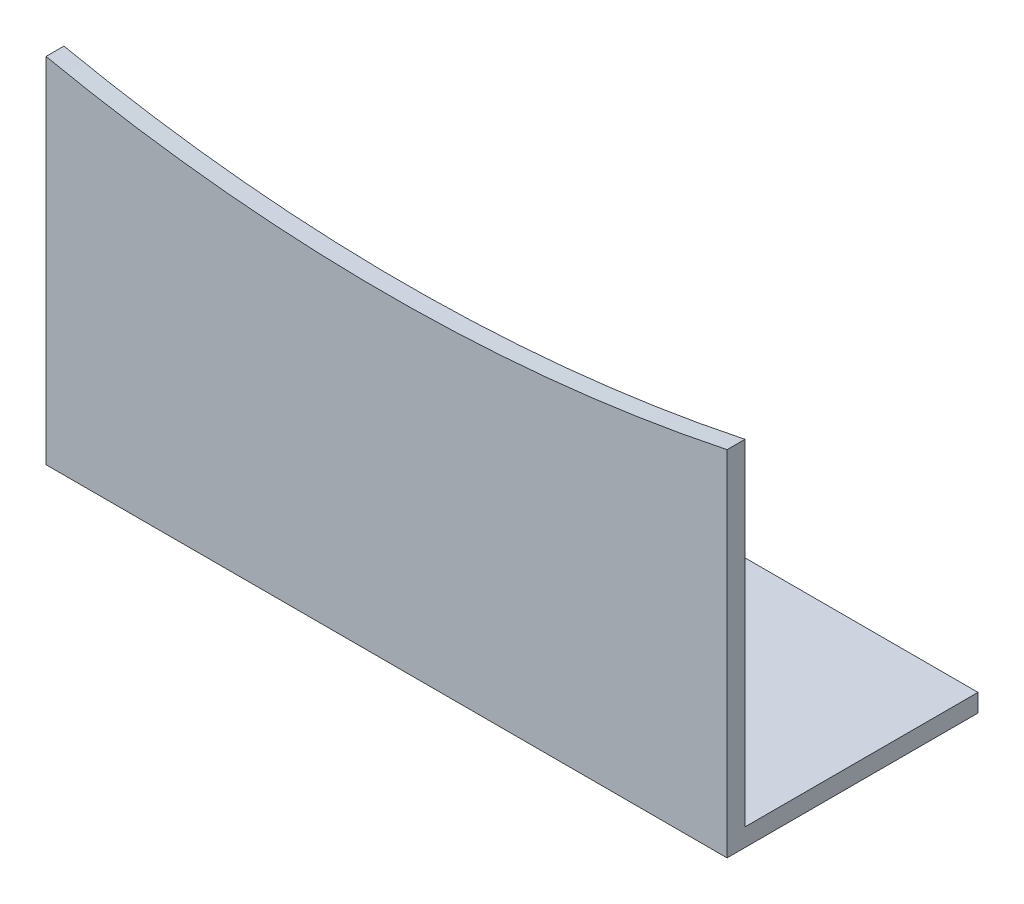
ISO-10303-21;
HEADER;
FILE_DESCRIPTION(('STEP AP214'),'2;1');
FILE_NAME('part.step','',(''),(''),'','','');
FILE_SCHEMA(('AUTOMOTIVE_DESIGN { 1 0 10303 214 1 1 1 1 }'));
ENDSEC;
DATA;
#1=APPLICATION_CONTEXT('core data for automotive mechanical design processes');
#2=APPLICATION_PROTOCOL_DEFINITION('international standard','automotive_design',2000,#1);
#3=PRODUCT_CONTEXT('',#1,'mechanical');
#4=PRODUCT('Part','Part','',(#3));
#5=PRODUCT_RELATED_PRODUCT_CATEGORY('part','',(#4));
#6=PRODUCT_DEFINITION_FORMATION('','',#4);
#7=PRODUCT_DEFINITION_CONTEXT('part definition',#1,'design');
#8=PRODUCT_DEFINITION('design','',#6,#7);
#9=PRODUCT_DEFINITION_SHAPE('','',#8);
#10=(LENGTH_UNIT() NAMED_UNIT(*) SI_UNIT(.MILLI.,.METRE.));
#11=(NAMED_UNIT(*) PLANE_ANGLE_UNIT() SI_UNIT($,.RADIAN.));
#12=(NAMED_UNIT(*) SI_UNIT($,.STERADIAN.) SOLID_ANGLE_UNIT());
#13=UNCERTAINTY_MEASURE_WITH_UNIT(LENGTH_MEASURE(1.E-05),#10,'distance_accuracy_value','');
#14=(GEOMETRIC_REPRESENTATION_CONTEXT(3) GLOBAL_UNCERTAINTY_ASSIGNED_CONTEXT((#13)) GLOBAL_UNIT_ASSIGNED_CONTEXT((#10,
#11,#12)) REPRESENTATION_CONTEXT('',''));
#15=CARTESIAN_POINT('',(0.,0.,0.));
#16=DIRECTION('',(0.,0.,1.));
#17=DIRECTION('',(1.,0.,0.));
#18=AXIS2_PLACEMENT_3D('',#15,#16,#17);
#19=CARTESIAN_POINT('',(38.,-220.,-30.002));
#20=DIRECTION('',(1.,0.,0.));
#21=DIRECTION('',(0.,0.,-1.));
#22=AXIS2_PLACEMENT_3D('',#19,#20,#21);
#23=PLANE('',#22);
#24=DIRECTION('',(0.,1.,0.));
#25=VECTOR('',#24,1.);
#26=CARTESIAN_POINT('',(38.,-220.,-28.));
#27=LINE('',#26,#25);
#28=CARTESIAN_POINT('',(38.,-220.,-28.));
#29=VERTEX_POINT('',#28);
#30=CARTESIAN_POINT('',(38.,-218.,-28.));
#31=VERTEX_POINT('',#30);
#32=EDGE_CURVE('E117',#29,#31,#27,.T.);
#33=ORIENTED_EDGE('',*,*,#32,.T.);
#34=DIRECTION('',(0.,0.,1.));
#35=VECTOR('',#34,1.);
#36=CARTESIAN_POINT('',(38.,-218.,-30.002));
#37=LINE('',#36,#35);
#38=CARTESIAN_POINT('',(38.,-218.,-2.));
#39=VERTEX_POINT('',#38);
#40=EDGE_CURVE('E98',#31,#39,#37,.T.);
#41=ORIENTED_EDGE('',*,*,#40,.T.);
#42=DIRECTION('',(0.,1.,0.));
#43=VECTOR('',#42,1.);
#44=CARTESIAN_POINT('',(38.,0.,-2.));
#45=LINE('',#44,#43);
#46=CARTESIAN_POINT('',(38.,-180.544315889479,-2.));
#47=VERTEX_POINT('',#46);
#48=EDGE_CURVE('E102',#39,#47,#45,.T.);
#49=ORIENTED_EDGE('',*,*,#48,.T.);
#50=DIRECTION('',(0.,0.,1.));
#51=VECTOR('',#50,1.);
#52=CARTESIAN_POINT('',(38.,-180.544315889479,-30.002));
#53=LINE('',#52,#51);
#54=CARTESIAN_POINT('',(38.,-180.544315889479,0.));
#55=VERTEX_POINT('',#54);
#56=EDGE_CURVE('E131',#47,#55,#53,.T.);
#57=ORIENTED_EDGE('',*,*,#56,.T.);
#58=DIRECTION('',(0.,1.,0.));
#59=VECTOR('',#58,1.);
#60=CARTESIAN_POINT('',(38.,-220.,0.));
#61=LINE('',#60,#59);
#62=CARTESIAN_POINT('',(38.,-220.,0.));
#63=VERTEX_POINT('',#62);
#64=EDGE_CURVE('E42',#63,#55,#61,.T.);
#65=ORIENTED_EDGE('',*,*,#64,.F.);
#66=DIRECTION('',(0.,0.,1.));
#67=VECTOR('',#66,1.);
#68=CARTESIAN_POINT('',(38.,-220.,-30.002));
#69=LINE('',#68,#67);
#70=EDGE_CURVE('E58',#29,#63,#69,.T.);
#71=ORIENTED_EDGE('',*,*,#70,.F.);
#72=EDGE_LOOP('',(#33,#41,#49,#57,#65,#71));
#73=FACE_BOUND('',#72,.T.);
#74=ADVANCED_FACE('F33',(#73),#23,.T.);
#75=CARTESIAN_POINT('',(0.,0.,-30.002));
#76=DIRECTION('',(0.,0.,1.));
#77=DIRECTION('',(1.,0.,0.));
#78=AXIS2_PLACEMENT_3D('',#75,#76,#77);
#79=CYLINDRICAL_SURFACE('',#78,184.5);
#80=ORIENTED_EDGE('',*,*,#56,.F.);
#81=CARTESIAN_POINT('',(0.,0.,-2.));
#82=DIRECTION('',(0.,0.,1.));
#83=DIRECTION('',(1.,0.,0.));
#84=AXIS2_PLACEMENT_3D('',#81,#82,#83);
#85=CIRCLE('',#84,184.5);
#86=CARTESIAN_POINT('',(-38.,-180.544315889479,-2.));
#87=VERTEX_POINT('',#86);
#88=EDGE_CURVE('E109',#47,#87,#85,.F.);
#89=ORIENTED_EDGE('',*,*,#88,.T.);
#90=DIRECTION('',(0.,0.,1.));
#91=VECTOR('',#90,1.);
#92=CARTESIAN_POINT('',(-38.,-180.544315889479,-30.002));
#93=LINE('',#92,#91);
#94=CARTESIAN_POINT('',(-38.,-180.544315889479,0.));
#95=VERTEX_POINT('',#94);
#96=EDGE_CURVE('E108',#87,#95,#93,.T.);
#97=ORIENTED_EDGE('',*,*,#96,.T.);
#98=CARTESIAN_POINT('',(0.,0.,0.));
#99=DIRECTION('',(0.,0.,-1.));
#100=DIRECTION('',(1.,0.,0.));
#101=AXIS2_PLACEMENT_3D('',#98,#99,#100);
#102=CIRCLE('',#101,184.5);
#103=EDGE_CURVE('E122',#55,#95,#102,.T.);
#104=ORIENTED_EDGE('',*,*,#103,.F.);
#105=EDGE_LOOP('',(#80,#89,#97,#104));
#106=FACE_BOUND('',#105,.T.);
#107=ADVANCED_FACE('F35',(#106),#79,.F.);
#108=CARTESIAN_POINT('',(0.,0.,-28.));
#109=DIRECTION('',(0.,0.,1.));
#110=DIRECTION('',(1.,0.,0.));
#111=AXIS2_PLACEMENT_3D('',#108,#109,#110);
#112=PLANE('',#111);
#113=DIRECTION('',(0.,-1.,0.));
#114=VECTOR('',#113,1.);
#115=CARTESIAN_POINT('',(-38.,-220.,-28.));
#116=LINE('',#115,#114);
#117=CARTESIAN_POINT('',(-38.,-218.,-28.));
#118=VERTEX_POINT('',#117);
#119=CARTESIAN_POINT('',(-38.,-220.,-28.));
#120=VERTEX_POINT('',#119);
#121=EDGE_CURVE('E120',#118,#120,#116,.T.);
#122=ORIENTED_EDGE('',*,*,#121,.F.);
#123=DIRECTION('',(1.,0.,0.));
#124=VECTOR('',#123,1.);
#125=CARTESIAN_POINT('',(0.,-218.,-28.));
#126=LINE('',#125,#124);
#127=EDGE_CURVE('E95',#118,#31,#126,.T.);
#128=ORIENTED_EDGE('',*,*,#127,.T.);
#129=ORIENTED_EDGE('',*,*,#32,.F.);
#130=DIRECTION('',(1.,0.,0.));
#131=VECTOR('',#130,1.);
#132=CARTESIAN_POINT('',(-40.,-220.,-28.));
#133=LINE('',#132,#131);
#134=EDGE_CURVE('E103',#120,#29,#133,.T.);
#135=ORIENTED_EDGE('',*,*,#134,.F.);
#136=EDGE_LOOP('',(#122,#128,#129,#135));
#137=FACE_BOUND('',#136,.T.);
#138=ADVANCED_FACE('F146',(#137),#112,.F.);
#139=CARTESIAN_POINT('',(-38.,-180.544315889479,-30.002));
#140=DIRECTION('',(-1.,0.,0.));
#141=DIRECTION('',(0.,0.,1.));
#142=AXIS2_PLACEMENT_3D('',#139,#140,#141);
#143=PLANE('',#142);
#144=DIRECTION('',(0.,0.,1.));
#145=VECTOR('',#144,1.);
#146=CARTESIAN_POINT('',(-38.,-218.,-30.002));
#147=LINE('',#146,#145);
#148=CARTESIAN_POINT('',(-38.,-218.,-2.));
#149=VERTEX_POINT('',#148);
#150=EDGE_CURVE('E90',#118,#149,#147,.T.);
#151=ORIENTED_EDGE('',*,*,#150,.F.);
#152=ORIENTED_EDGE('',*,*,#121,.T.);
#153=DIRECTION('',(0.,0.,1.));
#154=VECTOR('',#153,1.);
#155=CARTESIAN_POINT('',(-38.,-220.,-30.002));
#156=LINE('',#155,#154);
#157=CARTESIAN_POINT('',(-38.,-220.,0.));
#158=VERTEX_POINT('',#157);
#159=EDGE_CURVE('E37',#120,#158,#156,.T.);
#160=ORIENTED_EDGE('',*,*,#159,.T.);
#161=DIRECTION('',(0.,-1.,0.));
#162=VECTOR('',#161,1.);
#163=CARTESIAN_POINT('',(-38.,-180.544315889479,0.));
#164=LINE('',#163,#162);
#165=EDGE_CURVE('E124',#95,#158,#164,.T.);
#166=ORIENTED_EDGE('',*,*,#165,.F.);
#167=ORIENTED_EDGE('',*,*,#96,.F.);
#168=DIRECTION('',(0.,-1.,0.));
#169=VECTOR('',#168,1.);
#170=CARTESIAN_POINT('',(-38.,0.,-2.));
#171=LINE('',#170,#169);
#172=EDGE_CURVE('E50',#87,#149,#171,.T.);
#173=ORIENTED_EDGE('',*,*,#172,.T.);
#174=EDGE_LOOP('',(#151,#152,#160,#166,#167,#173));
#175=FACE_BOUND('',#174,.T.);
#176=ADVANCED_FACE('F106',(#175),#143,.T.);
#177=CARTESIAN_POINT('',(-38.,-220.,-30.002));
#178=DIRECTION('',(0.,-1.,0.));
#179=DIRECTION('',(0.,0.,-1.));
#180=AXIS2_PLACEMENT_3D('',#177,#178,#179);
#181=PLANE('',#180);
#182=ORIENTED_EDGE('',*,*,#159,.F.);
#183=ORIENTED_EDGE('',*,*,#134,.T.);
#184=ORIENTED_EDGE('',*,*,#70,.T.);
#185=DIRECTION('',(1.,0.,0.));
#186=VECTOR('',#185,1.);
#187=CARTESIAN_POINT('',(-38.,-220.,0.));
#188=LINE('',#187,#186);
#189=EDGE_CURVE('E11',#158,#63,#188,.T.);
#190=ORIENTED_EDGE('',*,*,#189,.F.);
#191=EDGE_LOOP('',(#182,#183,#184,#190));
#192=FACE_BOUND('',#191,.T.);
#193=ADVANCED_FACE('F138',(#192),#181,.T.);
#194=CARTESIAN_POINT('',(0.,0.,0.));
#195=DIRECTION('',(0.,0.,1.));
#196=DIRECTION('',(1.,0.,0.));
#197=AXIS2_PLACEMENT_3D('',#194,#195,#196);
#198=PLANE('',#197);
#199=ORIENTED_EDGE('',*,*,#189,.T.);
#200=ORIENTED_EDGE('',*,*,#64,.T.);
#201=ORIENTED_EDGE('',*,*,#103,.T.);
#202=ORIENTED_EDGE('',*,*,#165,.T.);
#203=EDGE_LOOP('',(#199,#200,#201,#202));
#204=FACE_BOUND('',#203,.T.);
#205=ADVANCED_FACE('F137',(#204),#198,.T.);
#206=CARTESIAN_POINT('',(-38.,-218.,-30.002));
#207=DIRECTION('',(0.,-1.,0.));
#208=DIRECTION('',(0.,0.,-1.));
#209=AXIS2_PLACEMENT_3D('',#206,#207,#208);
#210=PLANE('',#209);
#211=ORIENTED_EDGE('',*,*,#150,.T.);
#212=DIRECTION('',(1.,0.,0.));
#213=VECTOR('',#212,1.);
#214=CARTESIAN_POINT('',(0.,-218.,-2.));
#215=LINE('',#214,#213);
#216=EDGE_CURVE('E92',#149,#39,#215,.T.);
#217=ORIENTED_EDGE('',*,*,#216,.T.);
#218=ORIENTED_EDGE('',*,*,#40,.F.);
#219=ORIENTED_EDGE('',*,*,#127,.F.);
#220=EDGE_LOOP('',(#211,#217,#218,#219));
#221=FACE_BOUND('',#220,.T.);
#222=ADVANCED_FACE('F91',(#221),#210,.F.);
#223=CARTESIAN_POINT('',(0.,0.,-2.));
#224=DIRECTION('',(0.,0.,1.));
#225=DIRECTION('',(1.,0.,0.));
#226=AXIS2_PLACEMENT_3D('',#223,#224,#225);
#227=PLANE('',#226);
#228=ORIENTED_EDGE('',*,*,#216,.F.);
#229=ORIENTED_EDGE('',*,*,#172,.F.);
#230=ORIENTED_EDGE('',*,*,#88,.F.);
#231=ORIENTED_EDGE('',*,*,#48,.F.);
#232=EDGE_LOOP('',(#228,#229,#230,#231));
#233=FACE_BOUND('',#232,.T.);
#234=ADVANCED_FACE('F100',(#233),#227,.F.);
#235=CLOSED_SHELL('',(#74,#107,#138,#176,#193,#205,#222,#234));
#236=MANIFOLD_SOLID_BREP('B2',#235);
#237=ADVANCED_BREP_SHAPE_REPRESENTATION('',(#18,#236),#14);
#238=SHAPE_DEFINITION_REPRESENTATION(#9,#237);
ENDSEC;
END-ISO-10303-21;
